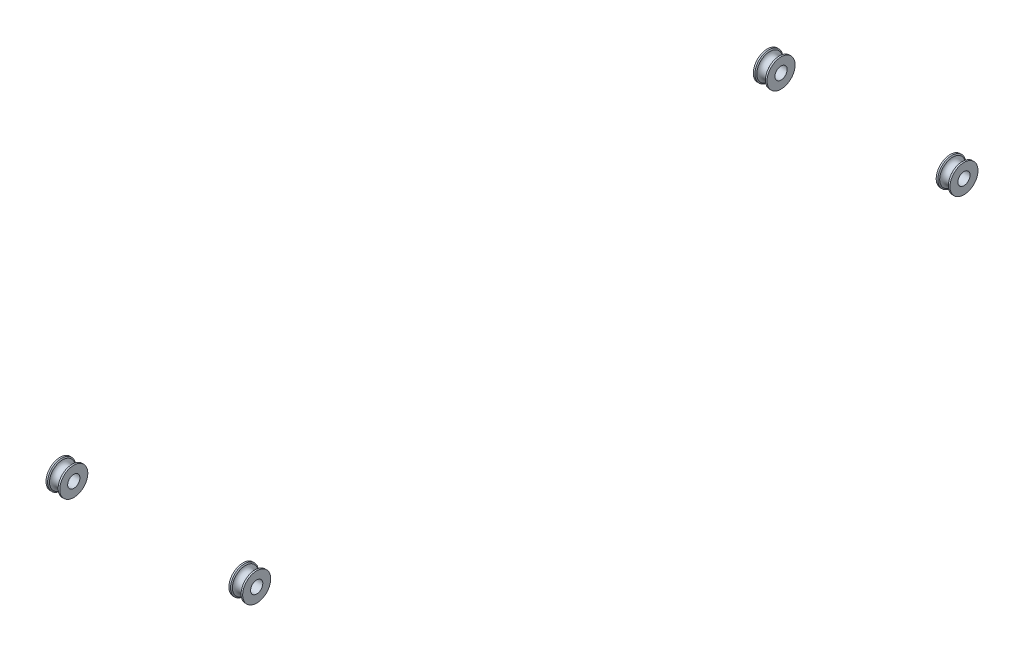
ISO-10303-21;
HEADER;
FILE_DESCRIPTION(('STEP AP214'),'2;1');
FILE_NAME('part.step','',(''),(''),'','','');
FILE_SCHEMA(('AUTOMOTIVE_DESIGN { 1 0 10303 214 1 1 1 1 }'));
ENDSEC;
DATA;
#1=APPLICATION_CONTEXT('core data for automotive mechanical design processes');
#2=APPLICATION_PROTOCOL_DEFINITION('international standard','automotive_design',2000,#1);
#3=PRODUCT_CONTEXT('',#1,'mechanical');
#4=PRODUCT('Part','Part','',(#3));
#5=PRODUCT_RELATED_PRODUCT_CATEGORY('part','',(#4));
#6=PRODUCT_DEFINITION_FORMATION('','',#4);
#7=PRODUCT_DEFINITION_CONTEXT('part definition',#1,'design');
#8=PRODUCT_DEFINITION('design','',#6,#7);
#9=PRODUCT_DEFINITION_SHAPE('','',#8);
#10=(LENGTH_UNIT() NAMED_UNIT(*) SI_UNIT(.MILLI.,.METRE.));
#11=(NAMED_UNIT(*) PLANE_ANGLE_UNIT() SI_UNIT($,.RADIAN.));
#12=(NAMED_UNIT(*) SI_UNIT($,.STERADIAN.) SOLID_ANGLE_UNIT());
#13=UNCERTAINTY_MEASURE_WITH_UNIT(LENGTH_MEASURE(1.E-05),#10,'distance_accuracy_value','');
#14=(GEOMETRIC_REPRESENTATION_CONTEXT(3) GLOBAL_UNCERTAINTY_ASSIGNED_CONTEXT((#13)) GLOBAL_UNIT_ASSIGNED_CONTEXT((#10,
#11,#12)) REPRESENTATION_CONTEXT('',''));
#15=CARTESIAN_POINT('',(0.,0.,0.));
#16=DIRECTION('',(0.,0.,1.));
#17=DIRECTION('',(1.,0.,0.));
#18=AXIS2_PLACEMENT_3D('',#15,#16,#17);
#19=CARTESIAN_POINT('',(102.4128,-70.8025,2.2225));
#20=DIRECTION('',(1.,0.,0.));
#21=DIRECTION('',(0.,0.,1.));
#22=AXIS2_PLACEMENT_3D('',#19,#20,#21);
#23=PLANE('',#22);
#24=CARTESIAN_POINT('',(102.4128,-70.8025,12.7));
#25=DIRECTION('',(1.,0.,0.));
#26=DIRECTION('',(0.,0.,-1.));
#27=AXIS2_PLACEMENT_3D('',#24,#25,#26);
#28=CIRCLE('',#27,6.35);
#29=CARTESIAN_POINT('',(102.4128,-70.8025,6.35));
#30=VERTEX_POINT('',#29);
#31=EDGE_CURVE('P0_E43',#30,#30,#28,.T.);
#32=ORIENTED_EDGE('',*,*,#31,.F.);
#33=EDGE_LOOP('',(#32));
#34=FACE_BOUND('',#33,.T.);
#35=CARTESIAN_POINT('',(102.4128,-70.8025,12.7));
#36=DIRECTION('',(1.,0.,0.));
#37=DIRECTION('',(0.,0.,-1.));
#38=AXIS2_PLACEMENT_3D('',#35,#36,#37);
#39=CIRCLE('',#38,14.605);
#40=CARTESIAN_POINT('',(102.4128,-70.8025,-1.905));
#41=VERTEX_POINT('',#40);
#42=EDGE_CURVE('P0_E10',#41,#41,#39,.T.);
#43=ORIENTED_EDGE('',*,*,#42,.T.);
#44=EDGE_LOOP('',(#43));
#45=FACE_BOUND('',#44,.T.);
#46=ADVANCED_FACE('P0_F15',(#34,#45),#23,.T.);
#47=CARTESIAN_POINT('',(95.25,-70.8025,12.7));
#48=DIRECTION('',(-1.,0.,0.));
#49=DIRECTION('',(0.,0.,-1.));
#50=AXIS2_PLACEMENT_3D('',#47,#48,#49);
#51=CYLINDRICAL_SURFACE('',#50,14.605);
#52=ORIENTED_EDGE('',*,*,#42,.F.);
#53=EDGE_LOOP('',(#52));
#54=FACE_BOUND('',#53,.T.);
#55=CARTESIAN_POINT('',(100.7364,-70.8025,12.7));
#56=DIRECTION('',(1.,0.,0.));
#57=DIRECTION('',(0.,0.,-1.));
#58=AXIS2_PLACEMENT_3D('',#55,#56,#57);
#59=CIRCLE('',#58,14.605);
#60=CARTESIAN_POINT('',(100.7364,-70.8025,-1.905));
#61=VERTEX_POINT('',#60);
#62=EDGE_CURVE('P0_E21',#61,#61,#59,.T.);
#63=ORIENTED_EDGE('',*,*,#62,.T.);
#64=EDGE_LOOP('',(#63));
#65=FACE_BOUND('',#64,.T.);
#66=ADVANCED_FACE('P0_F50',(#54,#65),#51,.T.);
#67=CARTESIAN_POINT('',(100.7364,-70.8025,12.7));
#68=DIRECTION('',(1.,0.,0.));
#69=DIRECTION('',(0.,0.,1.));
#70=AXIS2_PLACEMENT_3D('',#67,#68,#69);
#71=CONICAL_SURFACE('',#70,14.605,0.938047491792654);
#72=CARTESIAN_POINT('',(99.8982,-70.8025,12.7));
#73=DIRECTION('',(1.,0.,0.));
#74=DIRECTION('',(0.,0.,-1.));
#75=AXIS2_PLACEMENT_3D('',#72,#73,#74);
#76=CIRCLE('',#75,13.462);
#77=CARTESIAN_POINT('',(99.8982,-70.8025,-0.762000000000001));
#78=VERTEX_POINT('',#77);
#79=EDGE_CURVE('P0_E25',#78,#78,#76,.T.);
#80=ORIENTED_EDGE('',*,*,#79,.T.);
#81=EDGE_LOOP('',(#80));
#82=FACE_BOUND('',#81,.T.);
#83=ORIENTED_EDGE('',*,*,#62,.F.);
#84=EDGE_LOOP('',(#83));
#85=FACE_BOUND('',#84,.T.);
#86=ADVANCED_FACE('P0_F55',(#82,#85),#71,.T.);
#87=CARTESIAN_POINT('',(95.25,-70.8025,12.7));
#88=DIRECTION('',(-1.,0.,0.));
#89=DIRECTION('',(0.,0.,-1.));
#90=AXIS2_PLACEMENT_3D('',#87,#88,#89);
#91=TOROIDAL_SURFACE('',#90,14.605,4.78667026647959);
#92=ORIENTED_EDGE('',*,*,#79,.F.);
#93=EDGE_LOOP('',(#92));
#94=FACE_BOUND('',#93,.T.);
#95=CARTESIAN_POINT('',(90.6018,-70.8025,12.7));
#96=DIRECTION('',(1.,0.,0.));
#97=DIRECTION('',(0.,0.,-1.));
#98=AXIS2_PLACEMENT_3D('',#95,#96,#97);
#99=CIRCLE('',#98,13.4619999999999);
#100=CARTESIAN_POINT('',(90.6018,-70.8025,-0.76199999999986));
#101=VERTEX_POINT('',#100);
#102=EDGE_CURVE('P0_E29',#101,#101,#99,.T.);
#103=ORIENTED_EDGE('',*,*,#102,.T.);
#104=EDGE_LOOP('',(#103));
#105=FACE_BOUND('',#104,.T.);
#106=ADVANCED_FACE('P0_F60',(#94,#105),#91,.F.);
#107=CARTESIAN_POINT('',(89.7636,-70.8025,12.7));
#108=DIRECTION('',(-1.,0.,0.));
#109=DIRECTION('',(0.,0.,-1.));
#110=AXIS2_PLACEMENT_3D('',#107,#108,#109);
#111=CONICAL_SURFACE('',#110,14.605,0.938047491792756);
#112=ORIENTED_EDGE('',*,*,#102,.F.);
#113=EDGE_LOOP('',(#112));
#114=FACE_BOUND('',#113,.T.);
#115=CARTESIAN_POINT('',(89.7636,-70.8025,12.7));
#116=DIRECTION('',(1.,0.,0.));
#117=DIRECTION('',(0.,0.,-1.));
#118=AXIS2_PLACEMENT_3D('',#115,#116,#117);
#119=CIRCLE('',#118,14.605);
#120=CARTESIAN_POINT('',(89.7636,-70.8025,-1.905));
#121=VERTEX_POINT('',#120);
#122=EDGE_CURVE('P0_E34',#121,#121,#119,.T.);
#123=ORIENTED_EDGE('',*,*,#122,.T.);
#124=EDGE_LOOP('',(#123));
#125=FACE_BOUND('',#124,.T.);
#126=ADVANCED_FACE('P0_F66',(#114,#125),#111,.T.);
#127=CARTESIAN_POINT('',(95.25,-70.8025,12.7));
#128=DIRECTION('',(-1.,0.,0.));
#129=DIRECTION('',(0.,0.,-1.));
#130=AXIS2_PLACEMENT_3D('',#127,#128,#129);
#131=CYLINDRICAL_SURFACE('',#130,14.605);
#132=ORIENTED_EDGE('',*,*,#122,.F.);
#133=EDGE_LOOP('',(#132));
#134=FACE_BOUND('',#133,.T.);
#135=CARTESIAN_POINT('',(88.0872,-70.8025,12.7));
#136=DIRECTION('',(1.,0.,0.));
#137=DIRECTION('',(0.,0.,-1.));
#138=AXIS2_PLACEMENT_3D('',#135,#136,#137);
#139=CIRCLE('',#138,14.605);
#140=CARTESIAN_POINT('',(88.0872,-70.8025,-1.905));
#141=VERTEX_POINT('',#140);
#142=EDGE_CURVE('P0_E37',#141,#141,#139,.T.);
#143=ORIENTED_EDGE('',*,*,#142,.T.);
#144=EDGE_LOOP('',(#143));
#145=FACE_BOUND('',#144,.T.);
#146=ADVANCED_FACE('P0_F70',(#134,#145),#131,.T.);
#147=CARTESIAN_POINT('',(88.0872,-70.8025,2.22250000000012));
#148=DIRECTION('',(-1.,0.,0.));
#149=DIRECTION('',(0.,0.,-1.));
#150=AXIS2_PLACEMENT_3D('',#147,#148,#149);
#151=PLANE('',#150);
#152=ORIENTED_EDGE('',*,*,#142,.F.);
#153=EDGE_LOOP('',(#152));
#154=FACE_BOUND('',#153,.T.);
#155=CARTESIAN_POINT('',(88.0872,-70.8025,12.7));
#156=DIRECTION('',(1.,0.,0.));
#157=DIRECTION('',(0.,0.,-1.));
#158=AXIS2_PLACEMENT_3D('',#155,#156,#157);
#159=CIRCLE('',#158,6.35);
#160=CARTESIAN_POINT('',(88.0872,-70.8025,6.35));
#161=VERTEX_POINT('',#160);
#162=EDGE_CURVE('P0_E40',#161,#161,#159,.T.);
#163=ORIENTED_EDGE('',*,*,#162,.T.);
#164=EDGE_LOOP('',(#163));
#165=FACE_BOUND('',#164,.T.);
#166=ADVANCED_FACE('P0_F74',(#154,#165),#151,.T.);
#167=CARTESIAN_POINT('',(95.25,-70.8025,12.7));
#168=DIRECTION('',(-1.,0.,0.));
#169=DIRECTION('',(0.,0.,-1.));
#170=AXIS2_PLACEMENT_3D('',#167,#168,#169);
#171=CYLINDRICAL_SURFACE('',#170,6.35);
#172=ORIENTED_EDGE('',*,*,#162,.F.);
#173=EDGE_LOOP('',(#172));
#174=FACE_BOUND('',#173,.T.);
#175=ORIENTED_EDGE('',*,*,#31,.T.);
#176=EDGE_LOOP('',(#175));
#177=FACE_BOUND('',#176,.T.);
#178=ADVANCED_FACE('P0_F47',(#174,#177),#171,.F.);
#179=CLOSED_SHELL('',(#46,#66,#86,#106,#126,#146,#166,#178));
#180=MANIFOLD_SOLID_BREP('P0_B1',#179);
#181=CARTESIAN_POINT('',(102.4128,-70.8025,759.7775));
#182=DIRECTION('',(1.,0.,0.));
#183=DIRECTION('',(0.,0.,-1.));
#184=AXIS2_PLACEMENT_3D('',#181,#182,#183);
#185=PLANE('',#184);
#186=CARTESIAN_POINT('',(102.4128,-70.8025,749.3));
#187=DIRECTION('',(-1.,0.,0.));
#188=DIRECTION('',(0.,0.,1.));
#189=AXIS2_PLACEMENT_3D('',#186,#187,#188);
#190=CIRCLE('',#189,6.35);
#191=CARTESIAN_POINT('',(102.4128,-70.8025,755.65));
#192=VERTEX_POINT('',#191);
#193=EDGE_CURVE('P1_E43',#192,#192,#190,.T.);
#194=ORIENTED_EDGE('',*,*,#193,.T.);
#195=EDGE_LOOP('',(#194));
#196=FACE_BOUND('',#195,.T.);
#197=CARTESIAN_POINT('',(102.4128,-70.8025,749.3));
#198=DIRECTION('',(-1.,0.,0.));
#199=DIRECTION('',(0.,0.,1.));
#200=AXIS2_PLACEMENT_3D('',#197,#198,#199);
#201=CIRCLE('',#200,14.605);
#202=CARTESIAN_POINT('',(102.4128,-70.8025,763.905));
#203=VERTEX_POINT('',#202);
#204=EDGE_CURVE('P1_E10',#203,#203,#201,.T.);
#205=ORIENTED_EDGE('',*,*,#204,.F.);
#206=EDGE_LOOP('',(#205));
#207=FACE_BOUND('',#206,.T.);
#208=ADVANCED_FACE('P1_F15',(#196,#207),#185,.T.);
#209=CARTESIAN_POINT('',(95.25,-70.8025,749.3));
#210=DIRECTION('',(-1.,0.,0.));
#211=DIRECTION('',(0.,0.,1.));
#212=AXIS2_PLACEMENT_3D('',#209,#210,#211);
#213=CYLINDRICAL_SURFACE('',#212,14.605);
#214=ORIENTED_EDGE('',*,*,#204,.T.);
#215=EDGE_LOOP('',(#214));
#216=FACE_BOUND('',#215,.T.);
#217=CARTESIAN_POINT('',(100.7364,-70.8025,749.3));
#218=DIRECTION('',(-1.,0.,0.));
#219=DIRECTION('',(0.,0.,1.));
#220=AXIS2_PLACEMENT_3D('',#217,#218,#219);
#221=CIRCLE('',#220,14.605);
#222=CARTESIAN_POINT('',(100.7364,-70.8025,763.905));
#223=VERTEX_POINT('',#222);
#224=EDGE_CURVE('P1_E21',#223,#223,#221,.T.);
#225=ORIENTED_EDGE('',*,*,#224,.F.);
#226=EDGE_LOOP('',(#225));
#227=FACE_BOUND('',#226,.T.);
#228=ADVANCED_FACE('P1_F62',(#216,#227),#213,.T.);
#229=CARTESIAN_POINT('',(100.7364,-70.8025,749.3));
#230=DIRECTION('',(1.,0.,0.));
#231=DIRECTION('',(0.,0.,-1.));
#232=AXIS2_PLACEMENT_3D('',#229,#230,#231);
#233=CONICAL_SURFACE('',#232,14.605,0.938047491792654);
#234=CARTESIAN_POINT('',(99.8982,-70.8025,749.3));
#235=DIRECTION('',(-1.,0.,0.));
#236=DIRECTION('',(0.,0.,1.));
#237=AXIS2_PLACEMENT_3D('',#234,#235,#236);
#238=CIRCLE('',#237,13.462);
#239=CARTESIAN_POINT('',(99.8982,-70.8025,762.762));
#240=VERTEX_POINT('',#239);
#241=EDGE_CURVE('P1_E25',#240,#240,#238,.T.);
#242=ORIENTED_EDGE('',*,*,#241,.F.);
#243=EDGE_LOOP('',(#242));
#244=FACE_BOUND('',#243,.T.);
#245=ORIENTED_EDGE('',*,*,#224,.T.);
#246=EDGE_LOOP('',(#245));
#247=FACE_BOUND('',#246,.T.);
#248=ADVANCED_FACE('P1_F66',(#244,#247),#233,.T.);
#249=CARTESIAN_POINT('',(95.25,-70.8025,749.3));
#250=DIRECTION('',(-1.,0.,0.));
#251=DIRECTION('',(0.,0.,1.));
#252=AXIS2_PLACEMENT_3D('',#249,#250,#251);
#253=TOROIDAL_SURFACE('',#252,14.605,4.78667026647959);
#254=ORIENTED_EDGE('',*,*,#241,.T.);
#255=EDGE_LOOP('',(#254));
#256=FACE_BOUND('',#255,.T.);
#257=CARTESIAN_POINT('',(90.6018,-70.8025,749.3));
#258=DIRECTION('',(-1.,0.,0.));
#259=DIRECTION('',(0.,0.,1.));
#260=AXIS2_PLACEMENT_3D('',#257,#258,#259);
#261=CIRCLE('',#260,13.4619999999999);
#262=CARTESIAN_POINT('',(90.6018,-70.8025,762.762));
#263=VERTEX_POINT('',#262);
#264=EDGE_CURVE('P1_E29',#263,#263,#261,.T.);
#265=ORIENTED_EDGE('',*,*,#264,.F.);
#266=EDGE_LOOP('',(#265));
#267=FACE_BOUND('',#266,.T.);
#268=ADVANCED_FACE('P1_F70',(#256,#267),#253,.F.);
#269=CARTESIAN_POINT('',(89.7636,-70.8025,749.3));
#270=DIRECTION('',(-1.,0.,0.));
#271=DIRECTION('',(0.,0.,1.));
#272=AXIS2_PLACEMENT_3D('',#269,#270,#271);
#273=CONICAL_SURFACE('',#272,14.605,0.938047491792756);
#274=ORIENTED_EDGE('',*,*,#264,.T.);
#275=EDGE_LOOP('',(#274));
#276=FACE_BOUND('',#275,.T.);
#277=CARTESIAN_POINT('',(89.7636,-70.8025,749.3));
#278=DIRECTION('',(-1.,0.,0.));
#279=DIRECTION('',(0.,0.,1.));
#280=AXIS2_PLACEMENT_3D('',#277,#278,#279);
#281=CIRCLE('',#280,14.605);
#282=CARTESIAN_POINT('',(89.7636,-70.8025,763.905));
#283=VERTEX_POINT('',#282);
#284=EDGE_CURVE('P1_E34',#283,#283,#281,.T.);
#285=ORIENTED_EDGE('',*,*,#284,.F.);
#286=EDGE_LOOP('',(#285));
#287=FACE_BOUND('',#286,.T.);
#288=ADVANCED_FACE('P1_F77',(#276,#287),#273,.T.);
#289=CARTESIAN_POINT('',(95.25,-70.8025,749.3));
#290=DIRECTION('',(-1.,0.,0.));
#291=DIRECTION('',(0.,0.,1.));
#292=AXIS2_PLACEMENT_3D('',#289,#290,#291);
#293=CYLINDRICAL_SURFACE('',#292,14.605);
#294=ORIENTED_EDGE('',*,*,#284,.T.);
#295=EDGE_LOOP('',(#294));
#296=FACE_BOUND('',#295,.T.);
#297=CARTESIAN_POINT('',(88.0872,-70.8025,749.3));
#298=DIRECTION('',(-1.,0.,0.));
#299=DIRECTION('',(0.,0.,1.));
#300=AXIS2_PLACEMENT_3D('',#297,#298,#299);
#301=CIRCLE('',#300,14.605);
#302=CARTESIAN_POINT('',(88.0872,-70.8025,763.905));
#303=VERTEX_POINT('',#302);
#304=EDGE_CURVE('P1_E37',#303,#303,#301,.T.);
#305=ORIENTED_EDGE('',*,*,#304,.F.);
#306=EDGE_LOOP('',(#305));
#307=FACE_BOUND('',#306,.T.);
#308=ADVANCED_FACE('P1_F58',(#296,#307),#293,.T.);
#309=CARTESIAN_POINT('',(88.0872,-70.8025,759.7775));
#310=DIRECTION('',(-1.,0.,0.));
#311=DIRECTION('',(0.,0.,1.));
#312=AXIS2_PLACEMENT_3D('',#309,#310,#311);
#313=PLANE('',#312);
#314=ORIENTED_EDGE('',*,*,#304,.T.);
#315=EDGE_LOOP('',(#314));
#316=FACE_BOUND('',#315,.T.);
#317=CARTESIAN_POINT('',(88.0872,-70.8025,749.3));
#318=DIRECTION('',(-1.,0.,0.));
#319=DIRECTION('',(0.,0.,1.));
#320=AXIS2_PLACEMENT_3D('',#317,#318,#319);
#321=CIRCLE('',#320,6.35);
#322=CARTESIAN_POINT('',(88.0872,-70.8025,755.65));
#323=VERTEX_POINT('',#322);
#324=EDGE_CURVE('P1_E40',#323,#323,#321,.T.);
#325=ORIENTED_EDGE('',*,*,#324,.F.);
#326=EDGE_LOOP('',(#325));
#327=FACE_BOUND('',#326,.T.);
#328=ADVANCED_FACE('P1_F51',(#316,#327),#313,.T.);
#329=CARTESIAN_POINT('',(95.25,-70.8025,749.3));
#330=DIRECTION('',(-1.,0.,0.));
#331=DIRECTION('',(0.,0.,1.));
#332=AXIS2_PLACEMENT_3D('',#329,#330,#331);
#333=CYLINDRICAL_SURFACE('',#332,6.35);
#334=ORIENTED_EDGE('',*,*,#324,.T.);
#335=EDGE_LOOP('',(#334));
#336=FACE_BOUND('',#335,.T.);
#337=ORIENTED_EDGE('',*,*,#193,.F.);
#338=EDGE_LOOP('',(#337));
#339=FACE_BOUND('',#338,.T.);
#340=ADVANCED_FACE('P1_F49',(#336,#339),#333,.F.);
#341=CLOSED_SHELL('',(#208,#228,#248,#268,#288,#308,#328,#340));
#342=MANIFOLD_SOLID_BREP('P1_B1',#341);
#343=CARTESIAN_POINT('',(278.5872,-70.8025,759.7775));
#344=DIRECTION('',(-1.,0.,0.));
#345=DIRECTION('',(0.,0.,-1.));
#346=AXIS2_PLACEMENT_3D('',#343,#344,#345);
#347=PLANE('',#346);
#348=CARTESIAN_POINT('',(278.5872,-70.8025,749.3));
#349=DIRECTION('',(-1.,0.,0.));
#350=DIRECTION('',(0.,0.,1.));
#351=AXIS2_PLACEMENT_3D('',#348,#349,#350);
#352=CIRCLE('',#351,6.35);
#353=CARTESIAN_POINT('',(278.5872,-70.8025,755.65));
#354=VERTEX_POINT('',#353);
#355=EDGE_CURVE('P2_E43',#354,#354,#352,.T.);
#356=ORIENTED_EDGE('',*,*,#355,.F.);
#357=EDGE_LOOP('',(#356));
#358=FACE_BOUND('',#357,.T.);
#359=CARTESIAN_POINT('',(278.5872,-70.8025,749.3));
#360=DIRECTION('',(-1.,0.,0.));
#361=DIRECTION('',(0.,0.,1.));
#362=AXIS2_PLACEMENT_3D('',#359,#360,#361);
#363=CIRCLE('',#362,14.605);
#364=CARTESIAN_POINT('',(278.5872,-70.8025,763.905));
#365=VERTEX_POINT('',#364);
#366=EDGE_CURVE('P2_E10',#365,#365,#363,.T.);
#367=ORIENTED_EDGE('',*,*,#366,.T.);
#368=EDGE_LOOP('',(#367));
#369=FACE_BOUND('',#368,.T.);
#370=ADVANCED_FACE('P2_F15',(#358,#369),#347,.T.);
#371=CARTESIAN_POINT('',(285.75,-70.8025,749.3));
#372=DIRECTION('',(1.,0.,0.));
#373=DIRECTION('',(0.,0.,1.));
#374=AXIS2_PLACEMENT_3D('',#371,#372,#373);
#375=CYLINDRICAL_SURFACE('',#374,14.605);
#376=ORIENTED_EDGE('',*,*,#366,.F.);
#377=EDGE_LOOP('',(#376));
#378=FACE_BOUND('',#377,.T.);
#379=CARTESIAN_POINT('',(280.2636,-70.8025,749.3));
#380=DIRECTION('',(-1.,0.,0.));
#381=DIRECTION('',(0.,0.,1.));
#382=AXIS2_PLACEMENT_3D('',#379,#380,#381);
#383=CIRCLE('',#382,14.605);
#384=CARTESIAN_POINT('',(280.2636,-70.8025,763.905));
#385=VERTEX_POINT('',#384);
#386=EDGE_CURVE('P2_E21',#385,#385,#383,.T.);
#387=ORIENTED_EDGE('',*,*,#386,.T.);
#388=EDGE_LOOP('',(#387));
#389=FACE_BOUND('',#388,.T.);
#390=ADVANCED_FACE('P2_F50',(#378,#389),#375,.T.);
#391=CARTESIAN_POINT('',(280.2636,-70.8025,749.3));
#392=DIRECTION('',(-1.,0.,0.));
#393=DIRECTION('',(0.,0.,-1.));
#394=AXIS2_PLACEMENT_3D('',#391,#392,#393);
#395=CONICAL_SURFACE('',#394,14.605,0.938047491792654);
#396=CARTESIAN_POINT('',(281.1018,-70.8025,749.3));
#397=DIRECTION('',(-1.,0.,0.));
#398=DIRECTION('',(0.,0.,1.));
#399=AXIS2_PLACEMENT_3D('',#396,#397,#398);
#400=CIRCLE('',#399,13.462);
#401=CARTESIAN_POINT('',(281.1018,-70.8025,762.762));
#402=VERTEX_POINT('',#401);
#403=EDGE_CURVE('P2_E25',#402,#402,#400,.T.);
#404=ORIENTED_EDGE('',*,*,#403,.T.);
#405=EDGE_LOOP('',(#404));
#406=FACE_BOUND('',#405,.T.);
#407=ORIENTED_EDGE('',*,*,#386,.F.);
#408=EDGE_LOOP('',(#407));
#409=FACE_BOUND('',#408,.T.);
#410=ADVANCED_FACE('P2_F55',(#406,#409),#395,.T.);
#411=CARTESIAN_POINT('',(285.75,-70.8025,749.3));
#412=DIRECTION('',(1.,0.,0.));
#413=DIRECTION('',(0.,0.,1.));
#414=AXIS2_PLACEMENT_3D('',#411,#412,#413);
#415=TOROIDAL_SURFACE('',#414,14.605,4.78667026647959);
#416=ORIENTED_EDGE('',*,*,#403,.F.);
#417=EDGE_LOOP('',(#416));
#418=FACE_BOUND('',#417,.T.);
#419=CARTESIAN_POINT('',(290.3982,-70.8025,749.3));
#420=DIRECTION('',(-1.,0.,0.));
#421=DIRECTION('',(0.,0.,1.));
#422=AXIS2_PLACEMENT_3D('',#419,#420,#421);
#423=CIRCLE('',#422,13.4619999999999);
#424=CARTESIAN_POINT('',(290.3982,-70.8025,762.762));
#425=VERTEX_POINT('',#424);
#426=EDGE_CURVE('P2_E29',#425,#425,#423,.T.);
#427=ORIENTED_EDGE('',*,*,#426,.T.);
#428=EDGE_LOOP('',(#427));
#429=FACE_BOUND('',#428,.T.);
#430=ADVANCED_FACE('P2_F60',(#418,#429),#415,.F.);
#431=CARTESIAN_POINT('',(291.2364,-70.8025,749.3));
#432=DIRECTION('',(1.,0.,0.));
#433=DIRECTION('',(0.,0.,1.));
#434=AXIS2_PLACEMENT_3D('',#431,#432,#433);
#435=CONICAL_SURFACE('',#434,14.605,0.938047491792756);
#436=ORIENTED_EDGE('',*,*,#426,.F.);
#437=EDGE_LOOP('',(#436));
#438=FACE_BOUND('',#437,.T.);
#439=CARTESIAN_POINT('',(291.2364,-70.8025,749.3));
#440=DIRECTION('',(-1.,0.,0.));
#441=DIRECTION('',(0.,0.,1.));
#442=AXIS2_PLACEMENT_3D('',#439,#440,#441);
#443=CIRCLE('',#442,14.605);
#444=CARTESIAN_POINT('',(291.2364,-70.8025,763.905));
#445=VERTEX_POINT('',#444);
#446=EDGE_CURVE('P2_E34',#445,#445,#443,.T.);
#447=ORIENTED_EDGE('',*,*,#446,.T.);
#448=EDGE_LOOP('',(#447));
#449=FACE_BOUND('',#448,.T.);
#450=ADVANCED_FACE('P2_F66',(#438,#449),#435,.T.);
#451=CARTESIAN_POINT('',(285.75,-70.8025,749.3));
#452=DIRECTION('',(1.,0.,0.));
#453=DIRECTION('',(0.,0.,1.));
#454=AXIS2_PLACEMENT_3D('',#451,#452,#453);
#455=CYLINDRICAL_SURFACE('',#454,14.605);
#456=ORIENTED_EDGE('',*,*,#446,.F.);
#457=EDGE_LOOP('',(#456));
#458=FACE_BOUND('',#457,.T.);
#459=CARTESIAN_POINT('',(292.9128,-70.8025,749.3));
#460=DIRECTION('',(-1.,0.,0.));
#461=DIRECTION('',(0.,0.,1.));
#462=AXIS2_PLACEMENT_3D('',#459,#460,#461);
#463=CIRCLE('',#462,14.605);
#464=CARTESIAN_POINT('',(292.9128,-70.8025,763.905));
#465=VERTEX_POINT('',#464);
#466=EDGE_CURVE('P2_E37',#465,#465,#463,.T.);
#467=ORIENTED_EDGE('',*,*,#466,.T.);
#468=EDGE_LOOP('',(#467));
#469=FACE_BOUND('',#468,.T.);
#470=ADVANCED_FACE('P2_F70',(#458,#469),#455,.T.);
#471=CARTESIAN_POINT('',(292.9128,-70.8025,759.7775));
#472=DIRECTION('',(1.,0.,0.));
#473=DIRECTION('',(0.,0.,1.));
#474=AXIS2_PLACEMENT_3D('',#471,#472,#473);
#475=PLANE('',#474);
#476=ORIENTED_EDGE('',*,*,#466,.F.);
#477=EDGE_LOOP('',(#476));
#478=FACE_BOUND('',#477,.T.);
#479=CARTESIAN_POINT('',(292.9128,-70.8025,749.3));
#480=DIRECTION('',(-1.,0.,0.));
#481=DIRECTION('',(0.,0.,1.));
#482=AXIS2_PLACEMENT_3D('',#479,#480,#481);
#483=CIRCLE('',#482,6.35);
#484=CARTESIAN_POINT('',(292.9128,-70.8025,755.65));
#485=VERTEX_POINT('',#484);
#486=EDGE_CURVE('P2_E40',#485,#485,#483,.T.);
#487=ORIENTED_EDGE('',*,*,#486,.T.);
#488=EDGE_LOOP('',(#487));
#489=FACE_BOUND('',#488,.T.);
#490=ADVANCED_FACE('P2_F74',(#478,#489),#475,.T.);
#491=CARTESIAN_POINT('',(285.75,-70.8025,749.3));
#492=DIRECTION('',(1.,0.,0.));
#493=DIRECTION('',(0.,0.,1.));
#494=AXIS2_PLACEMENT_3D('',#491,#492,#493);
#495=CYLINDRICAL_SURFACE('',#494,6.35);
#496=ORIENTED_EDGE('',*,*,#486,.F.);
#497=EDGE_LOOP('',(#496));
#498=FACE_BOUND('',#497,.T.);
#499=ORIENTED_EDGE('',*,*,#355,.T.);
#500=EDGE_LOOP('',(#499));
#501=FACE_BOUND('',#500,.T.);
#502=ADVANCED_FACE('P2_F47',(#498,#501),#495,.F.);
#503=CLOSED_SHELL('',(#370,#390,#410,#430,#450,#470,#490,#502));
#504=MANIFOLD_SOLID_BREP('P2_B1',#503);
#505=CARTESIAN_POINT('',(278.5872,-70.8025,2.22250000000012));
#506=DIRECTION('',(-1.,0.,0.));
#507=DIRECTION('',(0.,0.,1.));
#508=AXIS2_PLACEMENT_3D('',#505,#506,#507);
#509=PLANE('',#508);
#510=CARTESIAN_POINT('',(278.5872,-70.8025,12.7000000000002));
#511=DIRECTION('',(1.,0.,0.));
#512=DIRECTION('',(0.,0.,-1.));
#513=AXIS2_PLACEMENT_3D('',#510,#511,#512);
#514=CIRCLE('',#513,6.35);
#515=CARTESIAN_POINT('',(278.5872,-70.8025,6.35000000000016));
#516=VERTEX_POINT('',#515);
#517=EDGE_CURVE('P3_E43',#516,#516,#514,.T.);
#518=ORIENTED_EDGE('',*,*,#517,.T.);
#519=EDGE_LOOP('',(#518));
#520=FACE_BOUND('',#519,.T.);
#521=CARTESIAN_POINT('',(278.5872,-70.8025,12.7000000000002));
#522=DIRECTION('',(1.,0.,0.));
#523=DIRECTION('',(0.,0.,-1.));
#524=AXIS2_PLACEMENT_3D('',#521,#522,#523);
#525=CIRCLE('',#524,14.605);
#526=CARTESIAN_POINT('',(278.5872,-70.8025,-1.90499999999984));
#527=VERTEX_POINT('',#526);
#528=EDGE_CURVE('P3_E10',#527,#527,#525,.T.);
#529=ORIENTED_EDGE('',*,*,#528,.F.);
#530=EDGE_LOOP('',(#529));
#531=FACE_BOUND('',#530,.T.);
#532=ADVANCED_FACE('P3_F15',(#520,#531),#509,.T.);
#533=CARTESIAN_POINT('',(285.75,-70.8025,12.7));
#534=DIRECTION('',(1.,0.,0.));
#535=DIRECTION('',(0.,0.,-1.));
#536=AXIS2_PLACEMENT_3D('',#533,#534,#535);
#537=CYLINDRICAL_SURFACE('',#536,14.605);
#538=ORIENTED_EDGE('',*,*,#528,.T.);
#539=EDGE_LOOP('',(#538));
#540=FACE_BOUND('',#539,.T.);
#541=CARTESIAN_POINT('',(280.2636,-70.8025,12.7000000000002));
#542=DIRECTION('',(1.,0.,0.));
#543=DIRECTION('',(0.,0.,-1.));
#544=AXIS2_PLACEMENT_3D('',#541,#542,#543);
#545=CIRCLE('',#544,14.605);
#546=CARTESIAN_POINT('',(280.2636,-70.8025,-1.90499999999984));
#547=VERTEX_POINT('',#546);
#548=EDGE_CURVE('P3_E21',#547,#547,#545,.T.);
#549=ORIENTED_EDGE('',*,*,#548,.F.);
#550=EDGE_LOOP('',(#549));
#551=FACE_BOUND('',#550,.T.);
#552=ADVANCED_FACE('P3_F62',(#540,#551),#537,.T.);
#553=CARTESIAN_POINT('',(280.2636,-70.8025,12.7000000000002));
#554=DIRECTION('',(-1.,0.,0.));
#555=DIRECTION('',(0.,0.,1.));
#556=AXIS2_PLACEMENT_3D('',#553,#554,#555);
#557=CONICAL_SURFACE('',#556,14.605,0.938047491792654);
#558=CARTESIAN_POINT('',(281.1018,-70.8025,12.7000000000002));
#559=DIRECTION('',(1.,0.,0.));
#560=DIRECTION('',(0.,0.,-1.));
#561=AXIS2_PLACEMENT_3D('',#558,#559,#560);
#562=CIRCLE('',#561,13.462);
#563=CARTESIAN_POINT('',(281.1018,-70.8025,-0.761999999999841));
#564=VERTEX_POINT('',#563);
#565=EDGE_CURVE('P3_E25',#564,#564,#562,.T.);
#566=ORIENTED_EDGE('',*,*,#565,.F.);
#567=EDGE_LOOP('',(#566));
#568=FACE_BOUND('',#567,.T.);
#569=ORIENTED_EDGE('',*,*,#548,.T.);
#570=EDGE_LOOP('',(#569));
#571=FACE_BOUND('',#570,.T.);
#572=ADVANCED_FACE('P3_F66',(#568,#571),#557,.T.);
#573=CARTESIAN_POINT('',(285.75,-70.8025,12.7));
#574=DIRECTION('',(1.,0.,0.));
#575=DIRECTION('',(0.,0.,-1.));
#576=AXIS2_PLACEMENT_3D('',#573,#574,#575);
#577=TOROIDAL_SURFACE('',#576,14.605,4.78667026647959);
#578=ORIENTED_EDGE('',*,*,#565,.T.);
#579=EDGE_LOOP('',(#578));
#580=FACE_BOUND('',#579,.T.);
#581=CARTESIAN_POINT('',(290.3982,-70.8025,12.7));
#582=DIRECTION('',(1.,0.,0.));
#583=DIRECTION('',(0.,0.,-1.));
#584=AXIS2_PLACEMENT_3D('',#581,#582,#583);
#585=CIRCLE('',#584,13.4619999999999);
#586=CARTESIAN_POINT('',(290.3982,-70.8025,-0.76199999999986));
#587=VERTEX_POINT('',#586);
#588=EDGE_CURVE('P3_E29',#587,#587,#585,.T.);
#589=ORIENTED_EDGE('',*,*,#588,.F.);
#590=EDGE_LOOP('',(#589));
#591=FACE_BOUND('',#590,.T.);
#592=ADVANCED_FACE('P3_F70',(#580,#591),#577,.F.);
#593=CARTESIAN_POINT('',(291.2364,-70.8025,12.7));
#594=DIRECTION('',(1.,0.,0.));
#595=DIRECTION('',(0.,0.,-1.));
#596=AXIS2_PLACEMENT_3D('',#593,#594,#595);
#597=CONICAL_SURFACE('',#596,14.605,0.938047491792756);
#598=ORIENTED_EDGE('',*,*,#588,.T.);
#599=EDGE_LOOP('',(#598));
#600=FACE_BOUND('',#599,.T.);
#601=CARTESIAN_POINT('',(291.2364,-70.8025,12.7));
#602=DIRECTION('',(1.,0.,0.));
#603=DIRECTION('',(0.,0.,-1.));
#604=AXIS2_PLACEMENT_3D('',#601,#602,#603);
#605=CIRCLE('',#604,14.605);
#606=CARTESIAN_POINT('',(291.2364,-70.8025,-1.905));
#607=VERTEX_POINT('',#606);
#608=EDGE_CURVE('P3_E34',#607,#607,#605,.T.);
#609=ORIENTED_EDGE('',*,*,#608,.F.);
#610=EDGE_LOOP('',(#609));
#611=FACE_BOUND('',#610,.T.);
#612=ADVANCED_FACE('P3_F77',(#600,#611),#597,.T.);
#613=CARTESIAN_POINT('',(285.75,-70.8025,12.7));
#614=DIRECTION('',(1.,0.,0.));
#615=DIRECTION('',(0.,0.,-1.));
#616=AXIS2_PLACEMENT_3D('',#613,#614,#615);
#617=CYLINDRICAL_SURFACE('',#616,14.605);
#618=ORIENTED_EDGE('',*,*,#608,.T.);
#619=EDGE_LOOP('',(#618));
#620=FACE_BOUND('',#619,.T.);
#621=CARTESIAN_POINT('',(292.9128,-70.8025,12.7));
#622=DIRECTION('',(1.,0.,0.));
#623=DIRECTION('',(0.,0.,-1.));
#624=AXIS2_PLACEMENT_3D('',#621,#622,#623);
#625=CIRCLE('',#624,14.605);
#626=CARTESIAN_POINT('',(292.9128,-70.8025,-1.905));
#627=VERTEX_POINT('',#626);
#628=EDGE_CURVE('P3_E37',#627,#627,#625,.T.);
#629=ORIENTED_EDGE('',*,*,#628,.F.);
#630=EDGE_LOOP('',(#629));
#631=FACE_BOUND('',#630,.T.);
#632=ADVANCED_FACE('P3_F58',(#620,#631),#617,.T.);
#633=CARTESIAN_POINT('',(292.9128,-70.8025,2.22250000000012));
#634=DIRECTION('',(1.,0.,0.));
#635=DIRECTION('',(0.,0.,-1.));
#636=AXIS2_PLACEMENT_3D('',#633,#634,#635);
#637=PLANE('',#636);
#638=ORIENTED_EDGE('',*,*,#628,.T.);
#639=EDGE_LOOP('',(#638));
#640=FACE_BOUND('',#639,.T.);
#641=CARTESIAN_POINT('',(292.9128,-70.8025,12.7));
#642=DIRECTION('',(1.,0.,0.));
#643=DIRECTION('',(0.,0.,-1.));
#644=AXIS2_PLACEMENT_3D('',#641,#642,#643);
#645=CIRCLE('',#644,6.35);
#646=CARTESIAN_POINT('',(292.9128,-70.8025,6.35));
#647=VERTEX_POINT('',#646);
#648=EDGE_CURVE('P3_E40',#647,#647,#645,.T.);
#649=ORIENTED_EDGE('',*,*,#648,.F.);
#650=EDGE_LOOP('',(#649));
#651=FACE_BOUND('',#650,.T.);
#652=ADVANCED_FACE('P3_F51',(#640,#651),#637,.T.);
#653=CARTESIAN_POINT('',(285.75,-70.8025,12.7));
#654=DIRECTION('',(1.,0.,0.));
#655=DIRECTION('',(0.,0.,-1.));
#656=AXIS2_PLACEMENT_3D('',#653,#654,#655);
#657=CYLINDRICAL_SURFACE('',#656,6.35);
#658=ORIENTED_EDGE('',*,*,#648,.T.);
#659=EDGE_LOOP('',(#658));
#660=FACE_BOUND('',#659,.T.);
#661=ORIENTED_EDGE('',*,*,#517,.F.);
#662=EDGE_LOOP('',(#661));
#663=FACE_BOUND('',#662,.T.);
#664=ADVANCED_FACE('P3_F49',(#660,#663),#657,.F.);
#665=CLOSED_SHELL('',(#532,#552,#572,#592,#612,#632,#652,#664));
#666=MANIFOLD_SOLID_BREP('P3_B1',#665);
#667=ADVANCED_BREP_SHAPE_REPRESENTATION('',(#18,#180,#342,#504,#666),#14);
#668=SHAPE_DEFINITION_REPRESENTATION(#9,#667);
ENDSEC;
END-ISO-10303-21;
